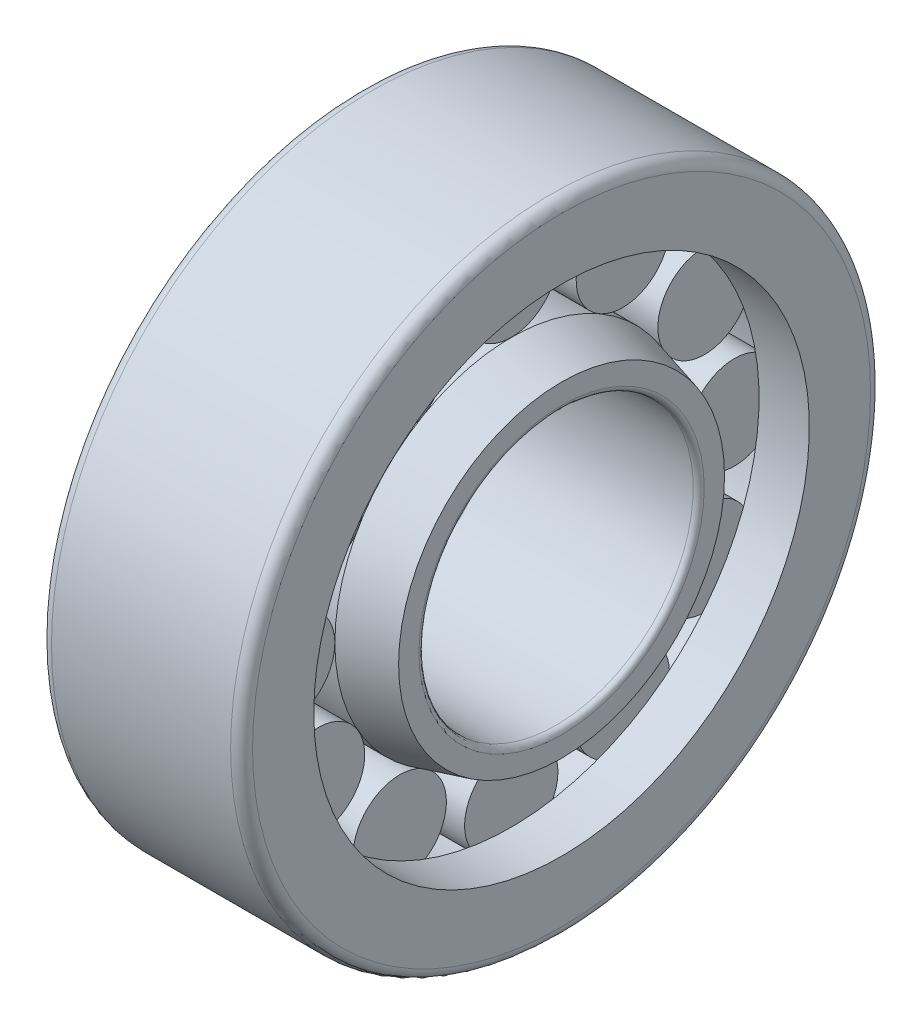
ISO-10303-21;
HEADER;
FILE_DESCRIPTION(('STEP AP214'),'2;1');
FILE_NAME('part.step','',(''),(''),'','','');
FILE_SCHEMA(('AUTOMOTIVE_DESIGN { 1 0 10303 214 1 1 1 1 }'));
ENDSEC;
DATA;
#1=APPLICATION_CONTEXT('core data for automotive mechanical design processes');
#2=APPLICATION_PROTOCOL_DEFINITION('international standard','automotive_design',2000,#1);
#3=PRODUCT_CONTEXT('',#1,'mechanical');
#4=PRODUCT('Part','Part','',(#3));
#5=PRODUCT_RELATED_PRODUCT_CATEGORY('part','',(#4));
#6=PRODUCT_DEFINITION_FORMATION('','',#4);
#7=PRODUCT_DEFINITION_CONTEXT('part definition',#1,'design');
#8=PRODUCT_DEFINITION('design','',#6,#7);
#9=PRODUCT_DEFINITION_SHAPE('','',#8);
#10=(LENGTH_UNIT() NAMED_UNIT(*) SI_UNIT(.MILLI.,.METRE.));
#11=(NAMED_UNIT(*) PLANE_ANGLE_UNIT() SI_UNIT($,.RADIAN.));
#12=(NAMED_UNIT(*) SI_UNIT($,.STERADIAN.) SOLID_ANGLE_UNIT());
#13=UNCERTAINTY_MEASURE_WITH_UNIT(LENGTH_MEASURE(1.E-05),#10,'distance_accuracy_value','');
#14=(GEOMETRIC_REPRESENTATION_CONTEXT(3) GLOBAL_UNCERTAINTY_ASSIGNED_CONTEXT((#13)) GLOBAL_UNIT_ASSIGNED_CONTEXT((#10,
#11,#12)) REPRESENTATION_CONTEXT('',''));
#15=CARTESIAN_POINT('',(0.,0.,0.));
#16=DIRECTION('',(0.,0.,1.));
#17=DIRECTION('',(1.,0.,0.));
#18=AXIS2_PLACEMENT_3D('',#15,#16,#17);
#19=CARTESIAN_POINT('',(2.75,12.77603976933,-7.37624999999984));
#20=DIRECTION('',(1.,0.,0.));
#21=DIRECTION('',(0.,-0.499999999999989,-0.866025403784445));
#22=AXIS2_PLACEMENT_3D('',#19,#20,#21);
#23=PLANE('',#22);
#24=CARTESIAN_POINT('',(2.75,10.566592457925,-6.10062499999986));
#25=DIRECTION('',(-1.,0.,0.));
#26=DIRECTION('',(0.,0.499999999999989,0.866025403784445));
#27=AXIS2_PLACEMENT_3D('',#24,#25,#26);
#28=CIRCLE('',#27,2.55125);
#29=CARTESIAN_POINT('',(2.75,11.8422174579249,-3.89117768859479));
#30=VERTEX_POINT('',#29);
#31=EDGE_CURVE('E53',#30,#30,#28,.T.);
#32=ORIENTED_EDGE('',*,*,#31,.T.);
#33=EDGE_LOOP('',(#32));
#34=FACE_BOUND('',#33,.T.);
#35=ADVANCED_FACE('F47',(#34),#23,.F.);
#36=CARTESIAN_POINT('',(8.25000000000001,12.77603976933,-7.37624999999984));
#37=DIRECTION('',(-1.,0.,0.));
#38=DIRECTION('',(0.,0.499999999999989,0.866025403784445));
#39=AXIS2_PLACEMENT_3D('',#36,#37,#38);
#40=PLANE('',#39);
#41=CARTESIAN_POINT('',(8.25000000000001,10.566592457925,-6.10062499999986));
#42=DIRECTION('',(-1.,0.,0.));
#43=DIRECTION('',(0.,0.499999999999989,0.866025403784445));
#44=AXIS2_PLACEMENT_3D('',#41,#42,#43);
#45=CIRCLE('',#44,2.55125);
#46=CARTESIAN_POINT('',(8.25000000000001,11.8422174579249,-3.89117768859479));
#47=VERTEX_POINT('',#46);
#48=EDGE_CURVE('E11',#47,#47,#45,.T.);
#49=ORIENTED_EDGE('',*,*,#48,.F.);
#50=EDGE_LOOP('',(#49));
#51=FACE_BOUND('',#50,.T.);
#52=ADVANCED_FACE('F62',(#51),#40,.F.);
#53=CARTESIAN_POINT('',(2.75,10.566592457925,-6.10062499999986));
#54=DIRECTION('',(-1.,0.,0.));
#55=DIRECTION('',(0.,0.499999999999989,0.866025403784445));
#56=AXIS2_PLACEMENT_3D('',#53,#54,#55);
#57=CYLINDRICAL_SURFACE('',#56,2.55125);
#58=ORIENTED_EDGE('',*,*,#31,.F.);
#59=EDGE_LOOP('',(#58));
#60=FACE_BOUND('',#59,.T.);
#61=ORIENTED_EDGE('',*,*,#48,.T.);
#62=EDGE_LOOP('',(#61));
#63=FACE_BOUND('',#62,.T.);
#64=ADVANCED_FACE('F60',(#60,#63),#57,.T.);
#65=CLOSED_SHELL('',(#35,#52,#64));
#66=MANIFOLD_SOLID_BREP('B2',#65);
#67=CARTESIAN_POINT('',(2.75,7.37625000000015,-12.7760397693298));
#68=DIRECTION('',(1.,0.,0.));
#69=DIRECTION('',(0.,-0.866025403784433,-0.50000000000001));
#70=AXIS2_PLACEMENT_3D('',#67,#68,#69);
#71=PLANE('',#70);
#72=CARTESIAN_POINT('',(2.75,6.10062500000012,-10.5665924579248));
#73=DIRECTION('',(-1.,0.,0.));
#74=DIRECTION('',(0.,0.866025403784433,0.50000000000001));
#75=AXIS2_PLACEMENT_3D('',#72,#73,#74);
#76=CIRCLE('',#75,2.55125);
#77=CARTESIAN_POINT('',(2.75,8.31007231140516,-9.29096745792478));
#78=VERTEX_POINT('',#77);
#79=EDGE_CURVE('E107',#78,#78,#76,.T.);
#80=ORIENTED_EDGE('',*,*,#79,.T.);
#81=EDGE_LOOP('',(#80));
#82=FACE_BOUND('',#81,.T.);
#83=ADVANCED_FACE('F101',(#82),#71,.F.);
#84=CARTESIAN_POINT('',(8.25000000000001,7.37625000000015,-12.7760397693298));
#85=DIRECTION('',(-1.,0.,0.));
#86=DIRECTION('',(0.,0.866025403784433,0.50000000000001));
#87=AXIS2_PLACEMENT_3D('',#84,#85,#86);
#88=PLANE('',#87);
#89=CARTESIAN_POINT('',(8.25000000000001,6.10062500000012,-10.5665924579248));
#90=DIRECTION('',(-1.,0.,0.));
#91=DIRECTION('',(0.,0.866025403784433,0.50000000000001));
#92=AXIS2_PLACEMENT_3D('',#89,#90,#91);
#93=CIRCLE('',#92,2.55125);
#94=CARTESIAN_POINT('',(8.25000000000001,8.31007231140516,-9.29096745792478));
#95=VERTEX_POINT('',#94);
#96=EDGE_CURVE('E46',#95,#95,#93,.T.);
#97=ORIENTED_EDGE('',*,*,#96,.F.);
#98=EDGE_LOOP('',(#97));
#99=FACE_BOUND('',#98,.T.);
#100=ADVANCED_FACE('F116',(#99),#88,.F.);
#101=CARTESIAN_POINT('',(2.75,6.10062500000012,-10.5665924579248));
#102=DIRECTION('',(-1.,0.,0.));
#103=DIRECTION('',(0.,0.866025403784433,0.50000000000001));
#104=AXIS2_PLACEMENT_3D('',#101,#102,#103);
#105=CYLINDRICAL_SURFACE('',#104,2.55125);
#106=ORIENTED_EDGE('',*,*,#79,.F.);
#107=EDGE_LOOP('',(#106));
#108=FACE_BOUND('',#107,.T.);
#109=ORIENTED_EDGE('',*,*,#96,.T.);
#110=EDGE_LOOP('',(#109));
#111=FACE_BOUND('',#110,.T.);
#112=ADVANCED_FACE('F114',(#108,#111),#105,.T.);
#113=CLOSED_SHELL('',(#83,#100,#112));
#114=MANIFOLD_SOLID_BREP('B6',#113);
#115=CARTESIAN_POINT('',(2.75,1.5452423535385E-13,-14.7525));
#116=DIRECTION('',(1.,0.,0.));
#117=DIRECTION('',(0.,-1.,0.));
#118=AXIS2_PLACEMENT_3D('',#115,#116,#117);
#119=PLANE('',#118);
#120=CARTESIAN_POINT('',(2.75,1.27801310056679E-13,-12.20125));
#121=DIRECTION('',(-1.,0.,0.));
#122=DIRECTION('',(0.,1.,0.));
#123=AXIS2_PLACEMENT_3D('',#120,#121,#122);
#124=CIRCLE('',#123,2.55125);
#125=CARTESIAN_POINT('',(2.75,2.55125000000013,-12.20125));
#126=VERTEX_POINT('',#125);
#127=EDGE_CURVE('E161',#126,#126,#124,.T.);
#128=ORIENTED_EDGE('',*,*,#127,.T.);
#129=EDGE_LOOP('',(#128));
#130=FACE_BOUND('',#129,.T.);
#131=ADVANCED_FACE('F155',(#130),#119,.F.);
#132=CARTESIAN_POINT('',(8.25000000000001,1.5452423535385E-13,-14.7525));
#133=DIRECTION('',(-1.,0.,0.));
#134=DIRECTION('',(0.,1.,0.));
#135=AXIS2_PLACEMENT_3D('',#132,#133,#134);
#136=PLANE('',#135);
#137=CARTESIAN_POINT('',(8.25000000000001,1.27801310056679E-13,-12.20125));
#138=DIRECTION('',(-1.,0.,0.));
#139=DIRECTION('',(0.,1.,0.));
#140=AXIS2_PLACEMENT_3D('',#137,#138,#139);
#141=CIRCLE('',#140,2.55125);
#142=CARTESIAN_POINT('',(8.25000000000001,2.55125000000013,-12.20125));
#143=VERTEX_POINT('',#142);
#144=EDGE_CURVE('E100',#143,#143,#141,.T.);
#145=ORIENTED_EDGE('',*,*,#144,.F.);
#146=EDGE_LOOP('',(#145));
#147=FACE_BOUND('',#146,.T.);
#148=ADVANCED_FACE('F170',(#147),#136,.F.);
#149=CARTESIAN_POINT('',(2.75,1.27801310056679E-13,-12.20125));
#150=DIRECTION('',(-1.,0.,0.));
#151=DIRECTION('',(0.,1.,0.));
#152=AXIS2_PLACEMENT_3D('',#149,#150,#151);
#153=CYLINDRICAL_SURFACE('',#152,2.55125);
#154=ORIENTED_EDGE('',*,*,#127,.F.);
#155=EDGE_LOOP('',(#154));
#156=FACE_BOUND('',#155,.T.);
#157=ORIENTED_EDGE('',*,*,#144,.T.);
#158=EDGE_LOOP('',(#157));
#159=FACE_BOUND('',#158,.T.);
#160=ADVANCED_FACE('F168',(#156,#159),#153,.T.);
#161=CLOSED_SHELL('',(#131,#148,#160));
#162=MANIFOLD_SOLID_BREP('B41',#161);
#163=CARTESIAN_POINT('',(2.75,-7.37624999999988,-12.77603976933));
#164=DIRECTION('',(1.,0.,0.));
#165=DIRECTION('',(0.,-0.866025403784443,0.499999999999992));
#166=AXIS2_PLACEMENT_3D('',#163,#164,#165);
#167=PLANE('',#166);
#168=CARTESIAN_POINT('',(2.75,-6.1006249999999,-10.5665924579249));
#169=DIRECTION('',(-1.,0.,0.));
#170=DIRECTION('',(0.,0.866025403784443,-0.499999999999992));
#171=AXIS2_PLACEMENT_3D('',#168,#169,#170);
#172=CIRCLE('',#171,2.55125);
#173=CARTESIAN_POINT('',(2.75,-3.89117768859484,-11.8422174579249));
#174=VERTEX_POINT('',#173);
#175=EDGE_CURVE('E215',#174,#174,#172,.T.);
#176=ORIENTED_EDGE('',*,*,#175,.T.);
#177=EDGE_LOOP('',(#176));
#178=FACE_BOUND('',#177,.T.);
#179=ADVANCED_FACE('F209',(#178),#167,.F.);
#180=CARTESIAN_POINT('',(8.25000000000001,-7.37624999999988,-12.77603976933));
#181=DIRECTION('',(-1.,0.,0.));
#182=DIRECTION('',(0.,0.866025403784443,-0.499999999999992));
#183=AXIS2_PLACEMENT_3D('',#180,#181,#182);
#184=PLANE('',#183);
#185=CARTESIAN_POINT('',(8.25000000000001,-6.1006249999999,-10.5665924579249));
#186=DIRECTION('',(-1.,0.,0.));
#187=DIRECTION('',(0.,0.866025403784443,-0.499999999999992));
#188=AXIS2_PLACEMENT_3D('',#185,#186,#187);
#189=CIRCLE('',#188,2.55125);
#190=CARTESIAN_POINT('',(8.25000000000001,-3.89117768859484,-11.8422174579249));
#191=VERTEX_POINT('',#190);
#192=EDGE_CURVE('E154',#191,#191,#189,.T.);
#193=ORIENTED_EDGE('',*,*,#192,.F.);
#194=EDGE_LOOP('',(#193));
#195=FACE_BOUND('',#194,.T.);
#196=ADVANCED_FACE('F224',(#195),#184,.F.);
#197=CARTESIAN_POINT('',(2.75,-6.1006249999999,-10.5665924579249));
#198=DIRECTION('',(-1.,0.,0.));
#199=DIRECTION('',(0.,0.866025403784443,-0.499999999999992));
#200=AXIS2_PLACEMENT_3D('',#197,#198,#199);
#201=CYLINDRICAL_SURFACE('',#200,2.55125);
#202=ORIENTED_EDGE('',*,*,#175,.F.);
#203=EDGE_LOOP('',(#202));
#204=FACE_BOUND('',#203,.T.);
#205=ORIENTED_EDGE('',*,*,#192,.T.);
#206=EDGE_LOOP('',(#205));
#207=FACE_BOUND('',#206,.T.);
#208=ADVANCED_FACE('F222',(#204,#207),#201,.T.);
#209=CLOSED_SHELL('',(#179,#196,#208));
#210=MANIFOLD_SOLID_BREP('B95',#209);
#211=CARTESIAN_POINT('',(2.75,-12.7760397693299,-7.37625000000011));
#212=DIRECTION('',(1.,0.,0.));
#213=DIRECTION('',(0.,-0.500000000000007,0.866025403784435));
#214=AXIS2_PLACEMENT_3D('',#211,#212,#213);
#215=PLANE('',#214);
#216=CARTESIAN_POINT('',(2.75,-10.5665924579248,-6.10062500000009));
#217=DIRECTION('',(-1.,0.,0.));
#218=DIRECTION('',(0.,0.500000000000007,-0.866025403784435));
#219=AXIS2_PLACEMENT_3D('',#216,#217,#218);
#220=CIRCLE('',#219,2.55125);
#221=CARTESIAN_POINT('',(2.75,-9.29096745792481,-8.31007231140513));
#222=VERTEX_POINT('',#221);
#223=EDGE_CURVE('E269',#222,#222,#220,.T.);
#224=ORIENTED_EDGE('',*,*,#223,.T.);
#225=EDGE_LOOP('',(#224));
#226=FACE_BOUND('',#225,.T.);
#227=ADVANCED_FACE('F263',(#226),#215,.F.);
#228=CARTESIAN_POINT('',(8.25000000000001,-12.7760397693299,-7.37625000000011));
#229=DIRECTION('',(-1.,0.,0.));
#230=DIRECTION('',(0.,0.500000000000007,-0.866025403784435));
#231=AXIS2_PLACEMENT_3D('',#228,#229,#230);
#232=PLANE('',#231);
#233=CARTESIAN_POINT('',(8.25000000000001,-10.5665924579248,-6.10062500000009));
#234=DIRECTION('',(-1.,0.,0.));
#235=DIRECTION('',(0.,0.500000000000007,-0.866025403784435));
#236=AXIS2_PLACEMENT_3D('',#233,#234,#235);
#237=CIRCLE('',#236,2.55125);
#238=CARTESIAN_POINT('',(8.25000000000001,-9.29096745792481,-8.31007231140513));
#239=VERTEX_POINT('',#238);
#240=EDGE_CURVE('E208',#239,#239,#237,.T.);
#241=ORIENTED_EDGE('',*,*,#240,.F.);
#242=EDGE_LOOP('',(#241));
#243=FACE_BOUND('',#242,.T.);
#244=ADVANCED_FACE('F278',(#243),#232,.F.);
#245=CARTESIAN_POINT('',(2.75,-10.5665924579248,-6.10062500000009));
#246=DIRECTION('',(-1.,0.,0.));
#247=DIRECTION('',(0.,0.500000000000007,-0.866025403784435));
#248=AXIS2_PLACEMENT_3D('',#245,#246,#247);
#249=CYLINDRICAL_SURFACE('',#248,2.55125);
#250=ORIENTED_EDGE('',*,*,#223,.F.);
#251=EDGE_LOOP('',(#250));
#252=FACE_BOUND('',#251,.T.);
#253=ORIENTED_EDGE('',*,*,#240,.T.);
#254=EDGE_LOOP('',(#253));
#255=FACE_BOUND('',#254,.T.);
#256=ADVANCED_FACE('F276',(#252,#255),#249,.T.);
#257=CLOSED_SHELL('',(#227,#244,#256));
#258=MANIFOLD_SOLID_BREP('B149',#257);
#259=CARTESIAN_POINT('',(2.75,-14.7525,0.));
#260=DIRECTION('',(1.,0.,0.));
#261=DIRECTION('',(0.,0.,1.));
#262=AXIS2_PLACEMENT_3D('',#259,#260,#261);
#263=PLANE('',#262);
#264=CARTESIAN_POINT('',(2.75,-12.20125,0.));
#265=DIRECTION('',(-1.,0.,0.));
#266=DIRECTION('',(0.,0.,-1.));
#267=AXIS2_PLACEMENT_3D('',#264,#265,#266);
#268=CIRCLE('',#267,2.55125);
#269=CARTESIAN_POINT('',(2.75,-12.20125,-2.55125));
#270=VERTEX_POINT('',#269);
#271=EDGE_CURVE('E323',#270,#270,#268,.T.);
#272=ORIENTED_EDGE('',*,*,#271,.T.);
#273=EDGE_LOOP('',(#272));
#274=FACE_BOUND('',#273,.T.);
#275=ADVANCED_FACE('F317',(#274),#263,.F.);
#276=CARTESIAN_POINT('',(8.25000000000001,-14.7525,0.));
#277=DIRECTION('',(-1.,0.,0.));
#278=DIRECTION('',(0.,0.,-1.));
#279=AXIS2_PLACEMENT_3D('',#276,#277,#278);
#280=PLANE('',#279);
#281=CARTESIAN_POINT('',(8.25000000000001,-12.20125,0.));
#282=DIRECTION('',(-1.,0.,0.));
#283=DIRECTION('',(0.,0.,-1.));
#284=AXIS2_PLACEMENT_3D('',#281,#282,#283);
#285=CIRCLE('',#284,2.55125);
#286=CARTESIAN_POINT('',(8.25000000000001,-12.20125,-2.55125));
#287=VERTEX_POINT('',#286);
#288=EDGE_CURVE('E262',#287,#287,#285,.T.);
#289=ORIENTED_EDGE('',*,*,#288,.F.);
#290=EDGE_LOOP('',(#289));
#291=FACE_BOUND('',#290,.T.);
#292=ADVANCED_FACE('F332',(#291),#280,.F.);
#293=CARTESIAN_POINT('',(2.75,-12.20125,0.));
#294=DIRECTION('',(-1.,0.,0.));
#295=DIRECTION('',(0.,0.,-1.));
#296=AXIS2_PLACEMENT_3D('',#293,#294,#295);
#297=CYLINDRICAL_SURFACE('',#296,2.55125);
#298=ORIENTED_EDGE('',*,*,#271,.F.);
#299=EDGE_LOOP('',(#298));
#300=FACE_BOUND('',#299,.T.);
#301=ORIENTED_EDGE('',*,*,#288,.T.);
#302=EDGE_LOOP('',(#301));
#303=FACE_BOUND('',#302,.T.);
#304=ADVANCED_FACE('F330',(#300,#303),#297,.T.);
#305=CLOSED_SHELL('',(#275,#292,#304));
#306=MANIFOLD_SOLID_BREP('B203',#305);
#307=CARTESIAN_POINT('',(2.75,-12.77603976933,7.37624999999993));
#308=DIRECTION('',(1.,0.,0.));
#309=DIRECTION('',(0.,0.499999999999995,0.866025403784442));
#310=AXIS2_PLACEMENT_3D('',#307,#308,#309);
#311=PLANE('',#310);
#312=CARTESIAN_POINT('',(2.75,-10.5665924579249,6.10062499999994));
#313=DIRECTION('',(-1.,0.,0.));
#314=DIRECTION('',(0.,-0.499999999999995,-0.866025403784442));
#315=AXIS2_PLACEMENT_3D('',#312,#313,#314);
#316=CIRCLE('',#315,2.55125);
#317=CARTESIAN_POINT('',(2.75,-11.8422174579249,3.89117768859488));
#318=VERTEX_POINT('',#317);
#319=EDGE_CURVE('E377',#318,#318,#316,.T.);
#320=ORIENTED_EDGE('',*,*,#319,.T.);
#321=EDGE_LOOP('',(#320));
#322=FACE_BOUND('',#321,.T.);
#323=ADVANCED_FACE('F371',(#322),#311,.F.);
#324=CARTESIAN_POINT('',(8.25000000000001,-12.77603976933,7.37624999999993));
#325=DIRECTION('',(-1.,0.,0.));
#326=DIRECTION('',(0.,-0.499999999999995,-0.866025403784442));
#327=AXIS2_PLACEMENT_3D('',#324,#325,#326);
#328=PLANE('',#327);
#329=CARTESIAN_POINT('',(8.25000000000001,-10.5665924579249,6.10062499999994));
#330=DIRECTION('',(-1.,0.,0.));
#331=DIRECTION('',(0.,-0.499999999999995,-0.866025403784442));
#332=AXIS2_PLACEMENT_3D('',#329,#330,#331);
#333=CIRCLE('',#332,2.55125);
#334=CARTESIAN_POINT('',(8.25000000000001,-11.8422174579249,3.89117768859488));
#335=VERTEX_POINT('',#334);
#336=EDGE_CURVE('E316',#335,#335,#333,.T.);
#337=ORIENTED_EDGE('',*,*,#336,.F.);
#338=EDGE_LOOP('',(#337));
#339=FACE_BOUND('',#338,.T.);
#340=ADVANCED_FACE('F386',(#339),#328,.F.);
#341=CARTESIAN_POINT('',(2.75,-10.5665924579249,6.10062499999994));
#342=DIRECTION('',(-1.,0.,0.));
#343=DIRECTION('',(0.,-0.499999999999995,-0.866025403784442));
#344=AXIS2_PLACEMENT_3D('',#341,#342,#343);
#345=CYLINDRICAL_SURFACE('',#344,2.55125);
#346=ORIENTED_EDGE('',*,*,#319,.F.);
#347=EDGE_LOOP('',(#346));
#348=FACE_BOUND('',#347,.T.);
#349=ORIENTED_EDGE('',*,*,#336,.T.);
#350=EDGE_LOOP('',(#349));
#351=FACE_BOUND('',#350,.T.);
#352=ADVANCED_FACE('F384',(#348,#351),#345,.T.);
#353=CLOSED_SHELL('',(#323,#340,#352));
#354=MANIFOLD_SOLID_BREP('B257',#353);
#355=CARTESIAN_POINT('',(2.75,-7.37625000000006,12.7760397693299));
#356=DIRECTION('',(1.,0.,0.));
#357=DIRECTION('',(0.,0.866025403784436,0.500000000000004));
#358=AXIS2_PLACEMENT_3D('',#355,#356,#357);
#359=PLANE('',#358);
#360=CARTESIAN_POINT('',(2.75,-6.10062500000005,10.5665924579249));
#361=DIRECTION('',(-1.,0.,0.));
#362=DIRECTION('',(0.,-0.866025403784436,-0.500000000000004));
#363=AXIS2_PLACEMENT_3D('',#360,#361,#362);
#364=CIRCLE('',#363,2.55125);
#365=CARTESIAN_POINT('',(2.75,-8.3100723114051,9.29096745792484));
#366=VERTEX_POINT('',#365);
#367=EDGE_CURVE('E431',#366,#366,#364,.T.);
#368=ORIENTED_EDGE('',*,*,#367,.T.);
#369=EDGE_LOOP('',(#368));
#370=FACE_BOUND('',#369,.T.);
#371=ADVANCED_FACE('F425',(#370),#359,.F.);
#372=CARTESIAN_POINT('',(8.25000000000001,-7.37625000000006,12.7760397693299));
#373=DIRECTION('',(-1.,0.,0.));
#374=DIRECTION('',(0.,-0.866025403784436,-0.500000000000004));
#375=AXIS2_PLACEMENT_3D('',#372,#373,#374);
#376=PLANE('',#375);
#377=CARTESIAN_POINT('',(8.25000000000001,-6.10062500000005,10.5665924579249));
#378=DIRECTION('',(-1.,0.,0.));
#379=DIRECTION('',(0.,-0.866025403784436,-0.500000000000004));
#380=AXIS2_PLACEMENT_3D('',#377,#378,#379);
#381=CIRCLE('',#380,2.55125);
#382=CARTESIAN_POINT('',(8.25000000000001,-8.3100723114051,9.29096745792484));
#383=VERTEX_POINT('',#382);
#384=EDGE_CURVE('E370',#383,#383,#381,.T.);
#385=ORIENTED_EDGE('',*,*,#384,.F.);
#386=EDGE_LOOP('',(#385));
#387=FACE_BOUND('',#386,.T.);
#388=ADVANCED_FACE('F440',(#387),#376,.F.);
#389=CARTESIAN_POINT('',(2.75,-6.10062500000005,10.5665924579249));
#390=DIRECTION('',(-1.,0.,0.));
#391=DIRECTION('',(0.,-0.866025403784436,-0.500000000000004));
#392=AXIS2_PLACEMENT_3D('',#389,#390,#391);
#393=CYLINDRICAL_SURFACE('',#392,2.55125);
#394=ORIENTED_EDGE('',*,*,#367,.F.);
#395=EDGE_LOOP('',(#394));
#396=FACE_BOUND('',#395,.T.);
#397=ORIENTED_EDGE('',*,*,#384,.T.);
#398=EDGE_LOOP('',(#397));
#399=FACE_BOUND('',#398,.T.);
#400=ADVANCED_FACE('F438',(#396,#399),#393,.T.);
#401=CLOSED_SHELL('',(#371,#388,#400));
#402=MANIFOLD_SOLID_BREP('B311',#401);
#403=CARTESIAN_POINT('',(2.75,0.,14.7525));
#404=DIRECTION('',(1.,0.,0.));
#405=DIRECTION('',(0.,1.,0.));
#406=AXIS2_PLACEMENT_3D('',#403,#404,#405);
#407=PLANE('',#406);
#408=CARTESIAN_POINT('',(2.75,0.,12.20125));
#409=DIRECTION('',(-1.,0.,0.));
#410=DIRECTION('',(0.,-1.,0.));
#411=AXIS2_PLACEMENT_3D('',#408,#409,#410);
#412=CIRCLE('',#411,2.55125);
#413=CARTESIAN_POINT('',(2.75,-2.55125000000005,12.20125));
#414=VERTEX_POINT('',#413);
#415=EDGE_CURVE('E485',#414,#414,#412,.T.);
#416=ORIENTED_EDGE('',*,*,#415,.T.);
#417=EDGE_LOOP('',(#416));
#418=FACE_BOUND('',#417,.T.);
#419=ADVANCED_FACE('F479',(#418),#407,.F.);
#420=CARTESIAN_POINT('',(8.25000000000001,0.,14.7525));
#421=DIRECTION('',(-1.,0.,0.));
#422=DIRECTION('',(0.,-1.,0.));
#423=AXIS2_PLACEMENT_3D('',#420,#421,#422);
#424=PLANE('',#423);
#425=CARTESIAN_POINT('',(8.25000000000001,0.,12.20125));
#426=DIRECTION('',(-1.,0.,0.));
#427=DIRECTION('',(0.,-1.,0.));
#428=AXIS2_PLACEMENT_3D('',#425,#426,#427);
#429=CIRCLE('',#428,2.55125);
#430=CARTESIAN_POINT('',(8.25000000000001,-2.55125000000005,12.20125));
#431=VERTEX_POINT('',#430);
#432=EDGE_CURVE('E424',#431,#431,#429,.T.);
#433=ORIENTED_EDGE('',*,*,#432,.F.);
#434=EDGE_LOOP('',(#433));
#435=FACE_BOUND('',#434,.T.);
#436=ADVANCED_FACE('F494',(#435),#424,.F.);
#437=CARTESIAN_POINT('',(2.75,0.,12.20125));
#438=DIRECTION('',(-1.,0.,0.));
#439=DIRECTION('',(0.,-1.,0.));
#440=AXIS2_PLACEMENT_3D('',#437,#438,#439);
#441=CYLINDRICAL_SURFACE('',#440,2.55125);
#442=ORIENTED_EDGE('',*,*,#415,.F.);
#443=EDGE_LOOP('',(#442));
#444=FACE_BOUND('',#443,.T.);
#445=ORIENTED_EDGE('',*,*,#432,.T.);
#446=EDGE_LOOP('',(#445));
#447=FACE_BOUND('',#446,.T.);
#448=ADVANCED_FACE('F492',(#444,#447),#441,.T.);
#449=CLOSED_SHELL('',(#419,#436,#448));
#450=MANIFOLD_SOLID_BREP('B365',#449);
#451=CARTESIAN_POINT('',(2.75,7.37624999999997,12.7760397693299));
#452=DIRECTION('',(1.,0.,0.));
#453=DIRECTION('',(0.,0.86602540378444,-0.499999999999998));
#454=AXIS2_PLACEMENT_3D('',#451,#452,#453);
#455=PLANE('',#454);
#456=CARTESIAN_POINT('',(2.75,6.10062499999997,10.5665924579249));
#457=DIRECTION('',(-1.,0.,0.));
#458=DIRECTION('',(0.,-0.86602540378444,0.499999999999998));
#459=AXIS2_PLACEMENT_3D('',#456,#457,#458);
#460=CIRCLE('',#459,2.55125);
#461=CARTESIAN_POINT('',(2.75,3.89117768859492,11.8422174579249));
#462=VERTEX_POINT('',#461);
#463=EDGE_CURVE('E539',#462,#462,#460,.T.);
#464=ORIENTED_EDGE('',*,*,#463,.T.);
#465=EDGE_LOOP('',(#464));
#466=FACE_BOUND('',#465,.T.);
#467=ADVANCED_FACE('F533',(#466),#455,.F.);
#468=CARTESIAN_POINT('',(8.25000000000001,7.37624999999997,12.7760397693299));
#469=DIRECTION('',(-1.,0.,0.));
#470=DIRECTION('',(0.,-0.86602540378444,0.499999999999998));
#471=AXIS2_PLACEMENT_3D('',#468,#469,#470);
#472=PLANE('',#471);
#473=CARTESIAN_POINT('',(8.25000000000001,6.10062499999997,10.5665924579249));
#474=DIRECTION('',(-1.,0.,0.));
#475=DIRECTION('',(0.,-0.86602540378444,0.499999999999998));
#476=AXIS2_PLACEMENT_3D('',#473,#474,#475);
#477=CIRCLE('',#476,2.55125);
#478=CARTESIAN_POINT('',(8.25000000000001,3.89117768859492,11.8422174579249));
#479=VERTEX_POINT('',#478);
#480=EDGE_CURVE('E478',#479,#479,#477,.T.);
#481=ORIENTED_EDGE('',*,*,#480,.F.);
#482=EDGE_LOOP('',(#481));
#483=FACE_BOUND('',#482,.T.);
#484=ADVANCED_FACE('F548',(#483),#472,.F.);
#485=CARTESIAN_POINT('',(2.75,6.10062499999997,10.5665924579249));
#486=DIRECTION('',(-1.,0.,0.));
#487=DIRECTION('',(0.,-0.86602540378444,0.499999999999998));
#488=AXIS2_PLACEMENT_3D('',#485,#486,#487);
#489=CYLINDRICAL_SURFACE('',#488,2.55125);
#490=ORIENTED_EDGE('',*,*,#463,.F.);
#491=EDGE_LOOP('',(#490));
#492=FACE_BOUND('',#491,.T.);
#493=ORIENTED_EDGE('',*,*,#480,.T.);
#494=EDGE_LOOP('',(#493));
#495=FACE_BOUND('',#494,.T.);
#496=ADVANCED_FACE('F546',(#492,#495),#489,.T.);
#497=CLOSED_SHELL('',(#467,#484,#496));
#498=MANIFOLD_SOLID_BREP('B419',#497);
#499=CARTESIAN_POINT('',(2.75,12.7760397693299,7.37625000000002));
#500=DIRECTION('',(1.,0.,0.));
#501=DIRECTION('',(0.,0.500000000000001,-0.866025403784438));
#502=AXIS2_PLACEMENT_3D('',#499,#500,#501);
#503=PLANE('',#502);
#504=CARTESIAN_POINT('',(2.75,10.5665924579249,6.10062500000001));
#505=DIRECTION('',(-1.,0.,0.));
#506=DIRECTION('',(0.,-0.500000000000001,0.866025403784438));
#507=AXIS2_PLACEMENT_3D('',#504,#505,#506);
#508=CIRCLE('',#507,2.55125);
#509=CARTESIAN_POINT('',(2.75,9.29096745792487,8.31007231140506));
#510=VERTEX_POINT('',#509);
#511=EDGE_CURVE('E593',#510,#510,#508,.T.);
#512=ORIENTED_EDGE('',*,*,#511,.T.);
#513=EDGE_LOOP('',(#512));
#514=FACE_BOUND('',#513,.T.);
#515=ADVANCED_FACE('F587',(#514),#503,.F.);
#516=CARTESIAN_POINT('',(8.25000000000001,12.7760397693299,7.37625000000002));
#517=DIRECTION('',(-1.,0.,0.));
#518=DIRECTION('',(0.,-0.500000000000001,0.866025403784438));
#519=AXIS2_PLACEMENT_3D('',#516,#517,#518);
#520=PLANE('',#519);
#521=CARTESIAN_POINT('',(8.25000000000001,10.5665924579249,6.10062500000001));
#522=DIRECTION('',(-1.,0.,0.));
#523=DIRECTION('',(0.,-0.500000000000001,0.866025403784438));
#524=AXIS2_PLACEMENT_3D('',#521,#522,#523);
#525=CIRCLE('',#524,2.55125);
#526=CARTESIAN_POINT('',(8.25000000000001,9.29096745792487,8.31007231140506));
#527=VERTEX_POINT('',#526);
#528=EDGE_CURVE('E532',#527,#527,#525,.T.);
#529=ORIENTED_EDGE('',*,*,#528,.F.);
#530=EDGE_LOOP('',(#529));
#531=FACE_BOUND('',#530,.T.);
#532=ADVANCED_FACE('F602',(#531),#520,.F.);
#533=CARTESIAN_POINT('',(2.75,10.5665924579249,6.10062500000001));
#534=DIRECTION('',(-1.,0.,0.));
#535=DIRECTION('',(0.,-0.500000000000001,0.866025403784438));
#536=AXIS2_PLACEMENT_3D('',#533,#534,#535);
#537=CYLINDRICAL_SURFACE('',#536,2.55125);
#538=ORIENTED_EDGE('',*,*,#511,.F.);
#539=EDGE_LOOP('',(#538));
#540=FACE_BOUND('',#539,.T.);
#541=ORIENTED_EDGE('',*,*,#528,.T.);
#542=EDGE_LOOP('',(#541));
#543=FACE_BOUND('',#542,.T.);
#544=ADVANCED_FACE('F600',(#540,#543),#537,.T.);
#545=CLOSED_SHELL('',(#515,#532,#544));
#546=MANIFOLD_SOLID_BREP('B473',#545);
#547=CARTESIAN_POINT('',(2.75,14.7525,0.));
#548=DIRECTION('',(1.,0.,0.));
#549=DIRECTION('',(0.,0.,-1.));
#550=AXIS2_PLACEMENT_3D('',#547,#548,#549);
#551=PLANE('',#550);
#552=CARTESIAN_POINT('',(2.75,12.20125,0.));
#553=DIRECTION('',(-1.,0.,0.));
#554=DIRECTION('',(0.,0.,1.));
#555=AXIS2_PLACEMENT_3D('',#552,#553,#554);
#556=CIRCLE('',#555,2.55125);
#557=CARTESIAN_POINT('',(2.75,12.20125,2.55125));
#558=VERTEX_POINT('',#557);
#559=EDGE_CURVE('E647',#558,#558,#556,.T.);
#560=ORIENTED_EDGE('',*,*,#559,.T.);
#561=EDGE_LOOP('',(#560));
#562=FACE_BOUND('',#561,.T.);
#563=ADVANCED_FACE('F641',(#562),#551,.F.);
#564=CARTESIAN_POINT('',(8.25000000000001,14.7525,0.));
#565=DIRECTION('',(-1.,0.,0.));
#566=DIRECTION('',(0.,0.,1.));
#567=AXIS2_PLACEMENT_3D('',#564,#565,#566);
#568=PLANE('',#567);
#569=CARTESIAN_POINT('',(8.25000000000001,12.20125,0.));
#570=DIRECTION('',(-1.,0.,0.));
#571=DIRECTION('',(0.,0.,1.));
#572=AXIS2_PLACEMENT_3D('',#569,#570,#571);
#573=CIRCLE('',#572,2.55125);
#574=CARTESIAN_POINT('',(8.25000000000001,12.20125,2.55125));
#575=VERTEX_POINT('',#574);
#576=EDGE_CURVE('E586',#575,#575,#573,.T.);
#577=ORIENTED_EDGE('',*,*,#576,.F.);
#578=EDGE_LOOP('',(#577));
#579=FACE_BOUND('',#578,.T.);
#580=ADVANCED_FACE('F656',(#579),#568,.F.);
#581=CARTESIAN_POINT('',(2.75,12.20125,0.));
#582=DIRECTION('',(-1.,0.,0.));
#583=DIRECTION('',(0.,0.,1.));
#584=AXIS2_PLACEMENT_3D('',#581,#582,#583);
#585=CYLINDRICAL_SURFACE('',#584,2.55125);
#586=ORIENTED_EDGE('',*,*,#559,.F.);
#587=EDGE_LOOP('',(#586));
#588=FACE_BOUND('',#587,.T.);
#589=ORIENTED_EDGE('',*,*,#576,.T.);
#590=EDGE_LOOP('',(#589));
#591=FACE_BOUND('',#590,.T.);
#592=ADVANCED_FACE('F654',(#588,#591),#585,.T.);
#593=CLOSED_SHELL('',(#563,#580,#592));
#594=MANIFOLD_SOLID_BREP('B527',#593);
#595=CARTESIAN_POINT('',(11.,16.9,0.));
#596=DIRECTION('',(-1.,0.,0.));
#597=DIRECTION('',(0.,0.,1.));
#598=AXIS2_PLACEMENT_3D('',#595,#596,#597);
#599=PLANE('',#598);
#600=CARTESIAN_POINT('',(11.,0.,0.));
#601=DIRECTION('',(-1.,0.,0.));
#602=DIRECTION('',(0.,0.,1.));
#603=AXIS2_PLACEMENT_3D('',#600,#601,#602);
#604=CIRCLE('',#603,16.9);
#605=CARTESIAN_POINT('',(11.,0.,16.9));
#606=VERTEX_POINT('',#605);
#607=EDGE_CURVE('E640',#606,#606,#604,.T.);
#608=ORIENTED_EDGE('',*,*,#607,.F.);
#609=EDGE_LOOP('',(#608));
#610=FACE_BOUND('',#609,.T.);
#611=CARTESIAN_POINT('',(11.,0.,0.));
#612=DIRECTION('',(-1.,0.,0.));
#613=DIRECTION('',(0.,0.,1.));
#614=AXIS2_PLACEMENT_3D('',#611,#612,#613);
#615=CIRCLE('',#614,13.5525);
#616=CARTESIAN_POINT('',(11.,0.,13.5525));
#617=VERTEX_POINT('',#616);
#618=EDGE_CURVE('E722',#617,#617,#615,.T.);
#619=ORIENTED_EDGE('',*,*,#618,.T.);
#620=EDGE_LOOP('',(#619));
#621=FACE_BOUND('',#620,.T.);
#622=ADVANCED_FACE('F688',(#610,#621),#599,.F.);
#623=CARTESIAN_POINT('',(10.4,0.,0.));
#624=DIRECTION('',(-1.,0.,0.));
#625=DIRECTION('',(0.,0.,1.));
#626=AXIS2_PLACEMENT_3D('',#623,#624,#625);
#627=TOROIDAL_SURFACE('',#626,16.9,0.599999999999998);
#628=CARTESIAN_POINT('',(10.4,0.,0.));
#629=DIRECTION('',(-1.,0.,0.));
#630=DIRECTION('',(0.,0.,1.));
#631=AXIS2_PLACEMENT_3D('',#628,#629,#630);
#632=CIRCLE('',#631,17.5);
#633=CARTESIAN_POINT('',(10.4,0.,17.5));
#634=VERTEX_POINT('',#633);
#635=EDGE_CURVE('E694',#634,#634,#632,.T.);
#636=ORIENTED_EDGE('',*,*,#635,.F.);
#637=EDGE_LOOP('',(#636));
#638=FACE_BOUND('',#637,.T.);
#639=ORIENTED_EDGE('',*,*,#607,.T.);
#640=EDGE_LOOP('',(#639));
#641=FACE_BOUND('',#640,.T.);
#642=ADVANCED_FACE('F771',(#638,#641),#627,.T.);
#643=CARTESIAN_POINT('',(0.,0.,0.));
#644=DIRECTION('',(-1.,0.,0.));
#645=DIRECTION('',(0.,0.,1.));
#646=AXIS2_PLACEMENT_3D('',#643,#644,#645);
#647=CYLINDRICAL_SURFACE('',#646,17.5);
#648=CARTESIAN_POINT('',(0.600000000000006,0.,0.));
#649=DIRECTION('',(-1.,0.,0.));
#650=DIRECTION('',(0.,0.,1.));
#651=AXIS2_PLACEMENT_3D('',#648,#649,#650);
#652=CIRCLE('',#651,17.5);
#653=CARTESIAN_POINT('',(0.600000000000006,0.,17.5));
#654=VERTEX_POINT('',#653);
#655=EDGE_CURVE('E698',#654,#654,#652,.T.);
#656=ORIENTED_EDGE('',*,*,#655,.F.);
#657=EDGE_LOOP('',(#656));
#658=FACE_BOUND('',#657,.T.);
#659=ORIENTED_EDGE('',*,*,#635,.T.);
#660=EDGE_LOOP('',(#659));
#661=FACE_BOUND('',#660,.T.);
#662=ADVANCED_FACE('F766',(#658,#661),#647,.T.);
#663=CARTESIAN_POINT('',(0.600000000000006,0.,0.));
#664=DIRECTION('',(-1.,0.,0.));
#665=DIRECTION('',(0.,0.,1.));
#666=AXIS2_PLACEMENT_3D('',#663,#664,#665);
#667=TOROIDAL_SURFACE('',#666,16.9,0.600000000000002);
#668=CARTESIAN_POINT('',(0.,0.,0.));
#669=DIRECTION('',(-1.,0.,0.));
#670=DIRECTION('',(0.,0.,1.));
#671=AXIS2_PLACEMENT_3D('',#668,#669,#670);
#672=CIRCLE('',#671,16.9);
#673=CARTESIAN_POINT('',(0.,0.,16.9));
#674=VERTEX_POINT('',#673);
#675=EDGE_CURVE('E702',#674,#674,#672,.T.);
#676=ORIENTED_EDGE('',*,*,#675,.F.);
#677=EDGE_LOOP('',(#676));
#678=FACE_BOUND('',#677,.T.);
#679=ORIENTED_EDGE('',*,*,#655,.T.);
#680=EDGE_LOOP('',(#679));
#681=FACE_BOUND('',#680,.T.);
#682=ADVANCED_FACE('F760',(#678,#681),#667,.T.);
#683=CARTESIAN_POINT('',(0.,16.9,0.));
#684=DIRECTION('',(1.,0.,0.));
#685=DIRECTION('',(0.,0.,-1.));
#686=AXIS2_PLACEMENT_3D('',#683,#684,#685);
#687=PLANE('',#686);
#688=CARTESIAN_POINT('',(0.,0.,0.));
#689=DIRECTION('',(-1.,0.,0.));
#690=DIRECTION('',(0.,0.,1.));
#691=AXIS2_PLACEMENT_3D('',#688,#689,#690);
#692=CIRCLE('',#691,13.5525);
#693=CARTESIAN_POINT('',(0.,0.,13.5525));
#694=VERTEX_POINT('',#693);
#695=EDGE_CURVE('E707',#694,#694,#692,.T.);
#696=ORIENTED_EDGE('',*,*,#695,.F.);
#697=EDGE_LOOP('',(#696));
#698=FACE_BOUND('',#697,.T.);
#699=ORIENTED_EDGE('',*,*,#675,.T.);
#700=EDGE_LOOP('',(#699));
#701=FACE_BOUND('',#700,.T.);
#702=ADVANCED_FACE('F754',(#698,#701),#687,.F.);
#703=CARTESIAN_POINT('',(0.,0.,0.));
#704=DIRECTION('',(-1.,0.,0.));
#705=DIRECTION('',(0.,0.,1.));
#706=AXIS2_PLACEMENT_3D('',#703,#704,#705);
#707=CYLINDRICAL_SURFACE('',#706,13.5525);
#708=CARTESIAN_POINT('',(2.75,0.,0.));
#709=DIRECTION('',(-1.,0.,0.));
#710=DIRECTION('',(0.,0.,1.));
#711=AXIS2_PLACEMENT_3D('',#708,#709,#710);
#712=CIRCLE('',#711,13.5525);
#713=CARTESIAN_POINT('',(2.75,0.,13.5525));
#714=VERTEX_POINT('',#713);
#715=EDGE_CURVE('E710',#714,#714,#712,.T.);
#716=ORIENTED_EDGE('',*,*,#715,.F.);
#717=EDGE_LOOP('',(#716));
#718=FACE_BOUND('',#717,.T.);
#719=ORIENTED_EDGE('',*,*,#695,.T.);
#720=EDGE_LOOP('',(#719));
#721=FACE_BOUND('',#720,.T.);
#722=ADVANCED_FACE('F748',(#718,#721),#707,.F.);
#723=CARTESIAN_POINT('',(2.75,14.7525,0.));
#724=DIRECTION('',(-1.,0.,0.));
#725=DIRECTION('',(0.,0.,1.));
#726=AXIS2_PLACEMENT_3D('',#723,#724,#725);
#727=PLANE('',#726);
#728=CARTESIAN_POINT('',(2.75,0.,0.));
#729=DIRECTION('',(-1.,0.,0.));
#730=DIRECTION('',(0.,0.,1.));
#731=AXIS2_PLACEMENT_3D('',#728,#729,#730);
#732=CIRCLE('',#731,14.7525);
#733=CARTESIAN_POINT('',(2.75,0.,14.7525));
#734=VERTEX_POINT('',#733);
#735=EDGE_CURVE('E713',#734,#734,#732,.T.);
#736=ORIENTED_EDGE('',*,*,#735,.F.);
#737=EDGE_LOOP('',(#736));
#738=FACE_BOUND('',#737,.T.);
#739=ORIENTED_EDGE('',*,*,#715,.T.);
#740=EDGE_LOOP('',(#739));
#741=FACE_BOUND('',#740,.T.);
#742=ADVANCED_FACE('F742',(#738,#741),#727,.F.);
#743=CARTESIAN_POINT('',(0.,0.,0.));
#744=DIRECTION('',(-1.,0.,0.));
#745=DIRECTION('',(0.,0.,1.));
#746=AXIS2_PLACEMENT_3D('',#743,#744,#745);
#747=CYLINDRICAL_SURFACE('',#746,14.7525);
#748=CARTESIAN_POINT('',(8.25000000000001,0.,0.));
#749=DIRECTION('',(-1.,0.,0.));
#750=DIRECTION('',(0.,0.,1.));
#751=AXIS2_PLACEMENT_3D('',#748,#749,#750);
#752=CIRCLE('',#751,14.7525);
#753=CARTESIAN_POINT('',(8.25000000000001,0.,14.7525));
#754=VERTEX_POINT('',#753);
#755=EDGE_CURVE('E716',#754,#754,#752,.T.);
#756=ORIENTED_EDGE('',*,*,#755,.F.);
#757=EDGE_LOOP('',(#756));
#758=FACE_BOUND('',#757,.T.);
#759=ORIENTED_EDGE('',*,*,#735,.T.);
#760=EDGE_LOOP('',(#759));
#761=FACE_BOUND('',#760,.T.);
#762=ADVANCED_FACE('F736',(#758,#761),#747,.F.);
#763=CARTESIAN_POINT('',(8.25000000000001,14.7525,0.));
#764=DIRECTION('',(1.,0.,0.));
#765=DIRECTION('',(0.,0.,-1.));
#766=AXIS2_PLACEMENT_3D('',#763,#764,#765);
#767=PLANE('',#766);
#768=CARTESIAN_POINT('',(8.25000000000001,0.,0.));
#769=DIRECTION('',(-1.,0.,0.));
#770=DIRECTION('',(0.,0.,1.));
#771=AXIS2_PLACEMENT_3D('',#768,#769,#770);
#772=CIRCLE('',#771,13.5525);
#773=CARTESIAN_POINT('',(8.25000000000001,0.,13.5525));
#774=VERTEX_POINT('',#773);
#775=EDGE_CURVE('E719',#774,#774,#772,.T.);
#776=ORIENTED_EDGE('',*,*,#775,.F.);
#777=EDGE_LOOP('',(#776));
#778=FACE_BOUND('',#777,.T.);
#779=ORIENTED_EDGE('',*,*,#755,.T.);
#780=EDGE_LOOP('',(#779));
#781=FACE_BOUND('',#780,.T.);
#782=ADVANCED_FACE('F730',(#778,#781),#767,.F.);
#783=CARTESIAN_POINT('',(0.,0.,0.));
#784=DIRECTION('',(-1.,0.,0.));
#785=DIRECTION('',(0.,0.,1.));
#786=AXIS2_PLACEMENT_3D('',#783,#784,#785);
#787=CYLINDRICAL_SURFACE('',#786,13.5525);
#788=ORIENTED_EDGE('',*,*,#618,.F.);
#789=EDGE_LOOP('',(#788));
#790=FACE_BOUND('',#789,.T.);
#791=ORIENTED_EDGE('',*,*,#775,.T.);
#792=EDGE_LOOP('',(#791));
#793=FACE_BOUND('',#792,.T.);
#794=ADVANCED_FACE('F727',(#790,#793),#787,.F.);
#795=CLOSED_SHELL('',(#622,#642,#662,#682,#702,#722,#742,#762,#782,#794));
#796=MANIFOLD_SOLID_BREP('B581',#795);
#797=CARTESIAN_POINT('',(0.,10.25,0.));
#798=DIRECTION('',(1.,0.,0.));
#799=DIRECTION('',(0.,0.,-1.));
#800=AXIS2_PLACEMENT_3D('',#797,#798,#799);
#801=PLANE('',#800);
#802=CARTESIAN_POINT('',(0.,0.,0.));
#803=DIRECTION('',(-1.,0.,0.));
#804=DIRECTION('',(0.,0.,1.));
#805=AXIS2_PLACEMENT_3D('',#802,#803,#804);
#806=CIRCLE('',#805,7.8);
#807=CARTESIAN_POINT('',(0.,0.,7.8));
#808=VERTEX_POINT('',#807);
#809=EDGE_CURVE('E687',#808,#808,#806,.T.);
#810=ORIENTED_EDGE('',*,*,#809,.F.);
#811=EDGE_LOOP('',(#810));
#812=FACE_BOUND('',#811,.T.);
#813=CARTESIAN_POINT('',(0.,0.,0.));
#814=DIRECTION('',(-1.,0.,0.));
#815=DIRECTION('',(0.,0.,1.));
#816=AXIS2_PLACEMENT_3D('',#813,#814,#815);
#817=CIRCLE('',#816,10.25);
#818=CARTESIAN_POINT('',(0.,0.,10.25));
#819=VERTEX_POINT('',#818);
#820=EDGE_CURVE('E870',#819,#819,#817,.T.);
#821=ORIENTED_EDGE('',*,*,#820,.T.);
#822=EDGE_LOOP('',(#821));
#823=FACE_BOUND('',#822,.T.);
#824=ADVANCED_FACE('F839',(#812,#823),#801,.F.);
#825=CARTESIAN_POINT('',(0.300000000000004,0.,0.));
#826=DIRECTION('',(-1.,0.,0.));
#827=DIRECTION('',(0.,0.,1.));
#828=AXIS2_PLACEMENT_3D('',#825,#826,#827);
#829=TOROIDAL_SURFACE('',#828,7.8,0.300000000000001);
#830=CARTESIAN_POINT('',(0.300000000000005,0.,0.));
#831=DIRECTION('',(-1.,0.,0.));
#832=DIRECTION('',(0.,0.,1.));
#833=AXIS2_PLACEMENT_3D('',#830,#831,#832);
#834=CIRCLE('',#833,7.5);
#835=CARTESIAN_POINT('',(0.300000000000005,0.,7.5));
#836=VERTEX_POINT('',#835);
#837=EDGE_CURVE('E845',#836,#836,#834,.T.);
#838=ORIENTED_EDGE('',*,*,#837,.F.);
#839=EDGE_LOOP('',(#838));
#840=FACE_BOUND('',#839,.T.);
#841=ORIENTED_EDGE('',*,*,#809,.T.);
#842=EDGE_LOOP('',(#841));
#843=FACE_BOUND('',#842,.T.);
#844=ADVANCED_FACE('F913',(#840,#843),#829,.T.);
#845=CARTESIAN_POINT('',(-10.0800941271879,0.,0.));
#846=DIRECTION('',(-1.,0.,0.));
#847=DIRECTION('',(0.,0.,1.));
#848=AXIS2_PLACEMENT_3D('',#845,#846,#847);
#849=CYLINDRICAL_SURFACE('',#848,7.5);
#850=CARTESIAN_POINT('',(10.7,0.,0.));
#851=DIRECTION('',(-1.,0.,0.));
#852=DIRECTION('',(0.,0.,1.));
#853=AXIS2_PLACEMENT_3D('',#850,#851,#852);
#854=CIRCLE('',#853,7.5);
#855=CARTESIAN_POINT('',(10.7,0.,7.5));
#856=VERTEX_POINT('',#855);
#857=EDGE_CURVE('E849',#856,#856,#854,.T.);
#858=ORIENTED_EDGE('',*,*,#857,.F.);
#859=EDGE_LOOP('',(#858));
#860=FACE_BOUND('',#859,.T.);
#861=ORIENTED_EDGE('',*,*,#837,.T.);
#862=EDGE_LOOP('',(#861));
#863=FACE_BOUND('',#862,.T.);
#864=ADVANCED_FACE('F908',(#860,#863),#849,.F.);
#865=CARTESIAN_POINT('',(10.7,0.,0.));
#866=DIRECTION('',(-1.,0.,0.));
#867=DIRECTION('',(0.,0.,1.));
#868=AXIS2_PLACEMENT_3D('',#865,#866,#867);
#869=TOROIDAL_SURFACE('',#868,7.8,0.3);
#870=CARTESIAN_POINT('',(11.,0.,0.));
#871=DIRECTION('',(-1.,0.,0.));
#872=DIRECTION('',(0.,0.,1.));
#873=AXIS2_PLACEMENT_3D('',#870,#871,#872);
#874=CIRCLE('',#873,7.8);
#875=CARTESIAN_POINT('',(11.,0.,7.8));
#876=VERTEX_POINT('',#875);
#877=EDGE_CURVE('E853',#876,#876,#874,.T.);
#878=ORIENTED_EDGE('',*,*,#877,.F.);
#879=EDGE_LOOP('',(#878));
#880=FACE_BOUND('',#879,.T.);
#881=ORIENTED_EDGE('',*,*,#857,.T.);
#882=EDGE_LOOP('',(#881));
#883=FACE_BOUND('',#882,.T.);
#884=ADVANCED_FACE('F902',(#880,#883),#869,.T.);
#885=CARTESIAN_POINT('',(11.,8.91313972081443,0.));
#886=DIRECTION('',(-1.,0.,0.));
#887=DIRECTION('',(0.,0.,1.));
#888=AXIS2_PLACEMENT_3D('',#885,#886,#887);
#889=PLANE('',#888);
#890=CARTESIAN_POINT('',(11.,0.,0.));
#891=DIRECTION('',(-1.,0.,0.));
#892=DIRECTION('',(0.,0.,1.));
#893=AXIS2_PLACEMENT_3D('',#890,#891,#892);
#894=CIRCLE('',#893,8.91313972081443);
#895=CARTESIAN_POINT('',(11.,0.,8.91313972081443));
#896=VERTEX_POINT('',#895);
#897=EDGE_CURVE('E858',#896,#896,#894,.T.);
#898=ORIENTED_EDGE('',*,*,#897,.F.);
#899=EDGE_LOOP('',(#898));
#900=FACE_BOUND('',#899,.T.);
#901=ORIENTED_EDGE('',*,*,#877,.T.);
#902=EDGE_LOOP('',(#901));
#903=FACE_BOUND('',#902,.T.);
#904=ADVANCED_FACE('F896',(#900,#903),#889,.F.);
#905=CARTESIAN_POINT('',(11.,0.,0.));
#906=DIRECTION('',(-1.,0.,0.));
#907=DIRECTION('',(0.,0.,1.));
#908=AXIS2_PLACEMENT_3D('',#905,#906,#907);
#909=CONICAL_SURFACE('',#908,8.91313972081443,0.261799387799143);
#910=CARTESIAN_POINT('',(8.25,0.,0.));
#911=DIRECTION('',(-1.,0.,0.));
#912=DIRECTION('',(0.,0.,1.));
#913=AXIS2_PLACEMENT_3D('',#910,#911,#912);
#914=CIRCLE('',#913,9.65);
#915=CARTESIAN_POINT('',(8.25,0.,9.65));
#916=VERTEX_POINT('',#915);
#917=EDGE_CURVE('E861',#916,#916,#914,.T.);
#918=ORIENTED_EDGE('',*,*,#917,.F.);
#919=EDGE_LOOP('',(#918));
#920=FACE_BOUND('',#919,.T.);
#921=ORIENTED_EDGE('',*,*,#897,.T.);
#922=EDGE_LOOP('',(#921));
#923=FACE_BOUND('',#922,.T.);
#924=ADVANCED_FACE('F890',(#920,#923),#909,.T.);
#925=CARTESIAN_POINT('',(-10.0800941271879,0.,0.));
#926=DIRECTION('',(-1.,0.,0.));
#927=DIRECTION('',(0.,0.,1.));
#928=AXIS2_PLACEMENT_3D('',#925,#926,#927);
#929=CYLINDRICAL_SURFACE('',#928,9.65);
#930=CARTESIAN_POINT('',(2.75,0.,0.));
#931=DIRECTION('',(-1.,0.,0.));
#932=DIRECTION('',(0.,0.,1.));
#933=AXIS2_PLACEMENT_3D('',#930,#931,#932);
#934=CIRCLE('',#933,9.65);
#935=CARTESIAN_POINT('',(2.75,0.,9.65));
#936=VERTEX_POINT('',#935);
#937=EDGE_CURVE('E864',#936,#936,#934,.T.);
#938=ORIENTED_EDGE('',*,*,#937,.F.);
#939=EDGE_LOOP('',(#938));
#940=FACE_BOUND('',#939,.T.);
#941=ORIENTED_EDGE('',*,*,#917,.T.);
#942=EDGE_LOOP('',(#941));
#943=FACE_BOUND('',#942,.T.);
#944=ADVANCED_FACE('F884',(#940,#943),#929,.T.);
#945=CARTESIAN_POINT('',(2.75,9.65,0.));
#946=DIRECTION('',(-1.,0.,0.));
#947=DIRECTION('',(0.,0.,1.));
#948=AXIS2_PLACEMENT_3D('',#945,#946,#947);
#949=PLANE('',#948);
#950=CARTESIAN_POINT('',(2.75,0.,0.));
#951=DIRECTION('',(-1.,0.,0.));
#952=DIRECTION('',(0.,0.,1.));
#953=AXIS2_PLACEMENT_3D('',#950,#951,#952);
#954=CIRCLE('',#953,10.25);
#955=CARTESIAN_POINT('',(2.75,0.,10.25));
#956=VERTEX_POINT('',#955);
#957=EDGE_CURVE('E867',#956,#956,#954,.T.);
#958=ORIENTED_EDGE('',*,*,#957,.F.);
#959=EDGE_LOOP('',(#958));
#960=FACE_BOUND('',#959,.T.);
#961=ORIENTED_EDGE('',*,*,#937,.T.);
#962=EDGE_LOOP('',(#961));
#963=FACE_BOUND('',#962,.T.);
#964=ADVANCED_FACE('F878',(#960,#963),#949,.F.);
#965=CARTESIAN_POINT('',(-10.0800941271879,0.,0.));
#966=DIRECTION('',(-1.,0.,0.));
#967=DIRECTION('',(0.,0.,1.));
#968=AXIS2_PLACEMENT_3D('',#965,#966,#967);
#969=CYLINDRICAL_SURFACE('',#968,10.25);
#970=ORIENTED_EDGE('',*,*,#820,.F.);
#971=EDGE_LOOP('',(#970));
#972=FACE_BOUND('',#971,.T.);
#973=ORIENTED_EDGE('',*,*,#957,.T.);
#974=EDGE_LOOP('',(#973));
#975=FACE_BOUND('',#974,.T.);
#976=ADVANCED_FACE('F875',(#972,#975),#969,.T.);
#977=CLOSED_SHELL('',(#824,#844,#864,#884,#904,#924,#944,#964,#976));
#978=MANIFOLD_SOLID_BREP('B635',#977);
#979=ADVANCED_BREP_SHAPE_REPRESENTATION('',(#18,#66,#114,#162,#210,#258,#306,#354,#402,#450,
#498,#546,#594,#796,#978),#14);
#980=SHAPE_DEFINITION_REPRESENTATION(#9,#979);
ENDSEC;
END-ISO-10303-21;
